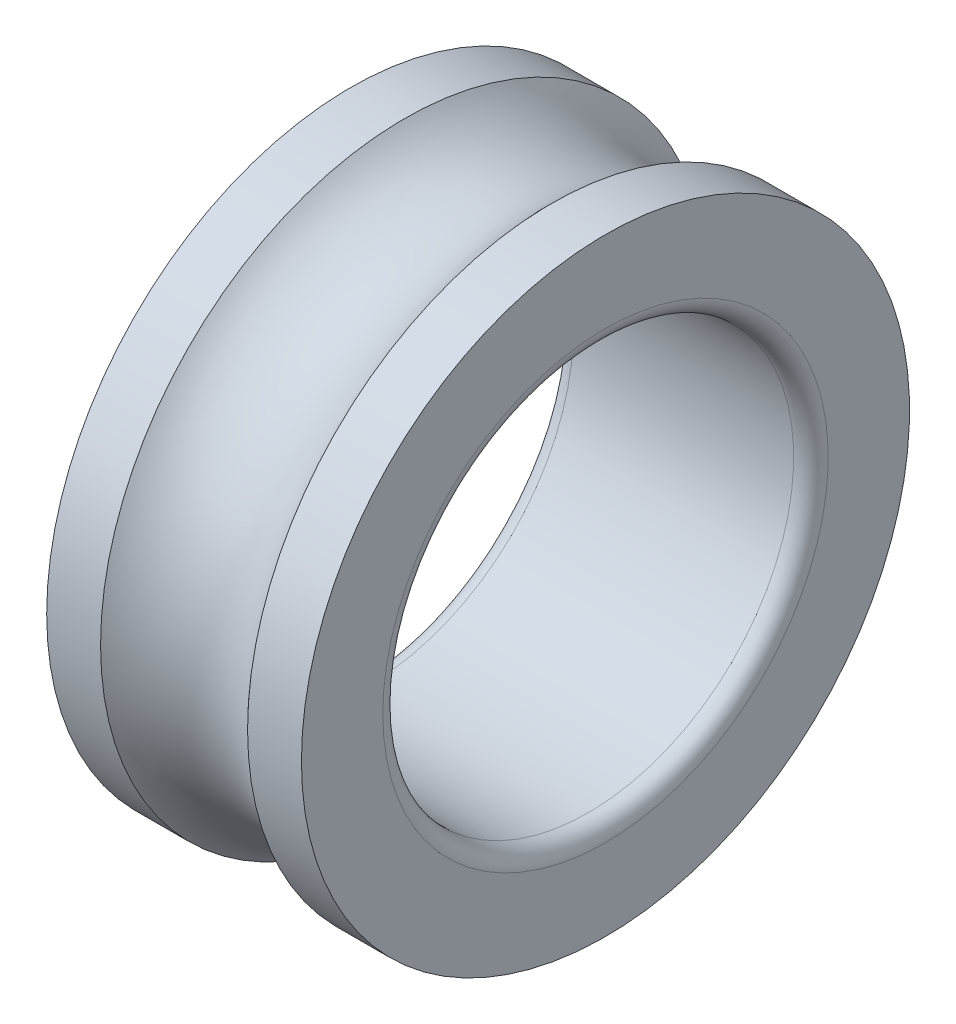
ISO-10303-21;
HEADER;
FILE_DESCRIPTION(('STEP AP214'),'2;1');
FILE_NAME('part.step','',(''),(''),'','','');
FILE_SCHEMA(('AUTOMOTIVE_DESIGN { 1 0 10303 214 1 1 1 1 }'));
ENDSEC;
DATA;
#1=APPLICATION_CONTEXT('core data for automotive mechanical design processes');
#2=APPLICATION_PROTOCOL_DEFINITION('international standard','automotive_design',2000,#1);
#3=PRODUCT_CONTEXT('',#1,'mechanical');
#4=PRODUCT('Part','Part','',(#3));
#5=PRODUCT_RELATED_PRODUCT_CATEGORY('part','',(#4));
#6=PRODUCT_DEFINITION_FORMATION('','',#4);
#7=PRODUCT_DEFINITION_CONTEXT('part definition',#1,'design');
#8=PRODUCT_DEFINITION('design','',#6,#7);
#9=PRODUCT_DEFINITION_SHAPE('','',#8);
#10=(LENGTH_UNIT() NAMED_UNIT(*) SI_UNIT(.MILLI.,.METRE.));
#11=(NAMED_UNIT(*) PLANE_ANGLE_UNIT() SI_UNIT($,.RADIAN.));
#12=(NAMED_UNIT(*) SI_UNIT($,.STERADIAN.) SOLID_ANGLE_UNIT());
#13=UNCERTAINTY_MEASURE_WITH_UNIT(LENGTH_MEASURE(1.E-05),#10,'distance_accuracy_value','');
#14=(GEOMETRIC_REPRESENTATION_CONTEXT(3) GLOBAL_UNCERTAINTY_ASSIGNED_CONTEXT((#13)) GLOBAL_UNIT_ASSIGNED_CONTEXT((#10,
#11,#12)) REPRESENTATION_CONTEXT('',''));
#15=CARTESIAN_POINT('',(0.,0.,0.));
#16=DIRECTION('',(0.,0.,1.));
#17=DIRECTION('',(1.,0.,0.));
#18=AXIS2_PLACEMENT_3D('',#15,#16,#17);
#19=CARTESIAN_POINT('',(-20.9591194968554,0.,0.));
#20=DIRECTION('',(-1.,0.,0.));
#21=DIRECTION('',(0.,0.,1.));
#22=AXIS2_PLACEMENT_3D('',#19,#20,#21);
#23=CYLINDRICAL_SURFACE('',#22,37.);
#24=CARTESIAN_POINT('',(-15.5,0.,0.));
#25=DIRECTION('',(-1.,0.,0.));
#26=DIRECTION('',(0.,0.,1.));
#27=AXIS2_PLACEMENT_3D('',#24,#25,#26);
#28=CIRCLE('',#27,37.);
#29=CARTESIAN_POINT('',(-15.5,0.,37.));
#30=VERTEX_POINT('',#29);
#31=EDGE_CURVE('E65',#30,#30,#28,.T.);
#32=ORIENTED_EDGE('',*,*,#31,.F.);
#33=EDGE_LOOP('',(#32));
#34=FACE_BOUND('',#33,.T.);
#35=CARTESIAN_POINT('',(-8.94427190999916,0.,0.));
#36=DIRECTION('',(-1.,0.,0.));
#37=DIRECTION('',(0.,0.,1.));
#38=AXIS2_PLACEMENT_3D('',#35,#36,#37);
#39=CIRCLE('',#38,37.);
#40=CARTESIAN_POINT('',(-8.94427190999916,0.,37.));
#41=VERTEX_POINT('',#40);
#42=EDGE_CURVE('E10',#41,#41,#39,.T.);
#43=ORIENTED_EDGE('',*,*,#42,.T.);
#44=EDGE_LOOP('',(#43));
#45=FACE_BOUND('',#44,.T.);
#46=ADVANCED_FACE('F37',(#34,#45),#23,.T.);
#47=CARTESIAN_POINT('',(0.,0.,0.));
#48=DIRECTION('',(-1.,0.,0.));
#49=DIRECTION('',(0.,0.,1.));
#50=AXIS2_PLACEMENT_3D('',#47,#48,#49);
#51=TOROIDAL_SURFACE('',#50,45.,12.);
#52=ORIENTED_EDGE('',*,*,#42,.F.);
#53=EDGE_LOOP('',(#52));
#54=FACE_BOUND('',#53,.T.);
#55=CARTESIAN_POINT('',(8.94427190999915,0.,0.));
#56=DIRECTION('',(-1.,0.,0.));
#57=DIRECTION('',(0.,0.,1.));
#58=AXIS2_PLACEMENT_3D('',#55,#56,#57);
#59=CIRCLE('',#58,37.);
#60=CARTESIAN_POINT('',(8.94427190999915,0.,37.));
#61=VERTEX_POINT('',#60);
#62=EDGE_CURVE('E43',#61,#61,#59,.T.);
#63=ORIENTED_EDGE('',*,*,#62,.T.);
#64=EDGE_LOOP('',(#63));
#65=FACE_BOUND('',#64,.T.);
#66=ADVANCED_FACE('F72',(#54,#65),#51,.F.);
#67=CARTESIAN_POINT('',(-20.9591194968554,0.,0.));
#68=DIRECTION('',(-1.,0.,0.));
#69=DIRECTION('',(0.,0.,1.));
#70=AXIS2_PLACEMENT_3D('',#67,#68,#69);
#71=CYLINDRICAL_SURFACE('',#70,37.);
#72=ORIENTED_EDGE('',*,*,#62,.F.);
#73=EDGE_LOOP('',(#72));
#74=FACE_BOUND('',#73,.T.);
#75=CARTESIAN_POINT('',(15.5,0.,0.));
#76=DIRECTION('',(-1.,0.,0.));
#77=DIRECTION('',(0.,0.,1.));
#78=AXIS2_PLACEMENT_3D('',#75,#76,#77);
#79=CIRCLE('',#78,37.);
#80=CARTESIAN_POINT('',(15.5,0.,37.));
#81=VERTEX_POINT('',#80);
#82=EDGE_CURVE('E47',#81,#81,#79,.T.);
#83=ORIENTED_EDGE('',*,*,#82,.T.);
#84=EDGE_LOOP('',(#83));
#85=FACE_BOUND('',#84,.T.);
#86=ADVANCED_FACE('F76',(#74,#85),#71,.T.);
#87=CARTESIAN_POINT('',(15.5,27.1,0.));
#88=DIRECTION('',(-1.,0.,0.));
#89=DIRECTION('',(0.,0.,1.));
#90=AXIS2_PLACEMENT_3D('',#87,#88,#89);
#91=PLANE('',#90);
#92=ORIENTED_EDGE('',*,*,#82,.F.);
#93=EDGE_LOOP('',(#92));
#94=FACE_BOUND('',#93,.T.);
#95=CARTESIAN_POINT('',(15.5,0.,0.));
#96=DIRECTION('',(-1.,0.,0.));
#97=DIRECTION('',(0.,0.,1.));
#98=AXIS2_PLACEMENT_3D('',#95,#96,#97);
#99=CIRCLE('',#98,27.1);
#100=CARTESIAN_POINT('',(15.5,0.,27.1));
#101=VERTEX_POINT('',#100);
#102=EDGE_CURVE('E51',#101,#101,#99,.T.);
#103=ORIENTED_EDGE('',*,*,#102,.T.);
#104=EDGE_LOOP('',(#103));
#105=FACE_BOUND('',#104,.T.);
#106=ADVANCED_FACE('F81',(#94,#105),#91,.F.);
#107=CARTESIAN_POINT('',(13.4,0.,0.));
#108=DIRECTION('',(-1.,0.,0.));
#109=DIRECTION('',(0.,0.,1.));
#110=AXIS2_PLACEMENT_3D('',#107,#108,#109);
#111=TOROIDAL_SURFACE('',#110,27.1,2.1);
#112=ORIENTED_EDGE('',*,*,#102,.F.);
#113=EDGE_LOOP('',(#112));
#114=FACE_BOUND('',#113,.T.);
#115=CARTESIAN_POINT('',(13.4,0.,0.));
#116=DIRECTION('',(-1.,0.,0.));
#117=DIRECTION('',(0.,0.,1.));
#118=AXIS2_PLACEMENT_3D('',#115,#116,#117);
#119=CIRCLE('',#118,25.);
#120=CARTESIAN_POINT('',(13.4,0.,25.));
#121=VERTEX_POINT('',#120);
#122=EDGE_CURVE('E56',#121,#121,#119,.T.);
#123=ORIENTED_EDGE('',*,*,#122,.T.);
#124=EDGE_LOOP('',(#123));
#125=FACE_BOUND('',#124,.T.);
#126=ADVANCED_FACE('F87',(#114,#125),#111,.T.);
#127=CARTESIAN_POINT('',(-20.9591194968554,0.,0.));
#128=DIRECTION('',(-1.,0.,0.));
#129=DIRECTION('',(0.,0.,1.));
#130=AXIS2_PLACEMENT_3D('',#127,#128,#129);
#131=CYLINDRICAL_SURFACE('',#130,25.);
#132=ORIENTED_EDGE('',*,*,#122,.F.);
#133=EDGE_LOOP('',(#132));
#134=FACE_BOUND('',#133,.T.);
#135=CARTESIAN_POINT('',(-13.4,0.,0.));
#136=DIRECTION('',(-1.,0.,0.));
#137=DIRECTION('',(0.,0.,1.));
#138=AXIS2_PLACEMENT_3D('',#135,#136,#137);
#139=CIRCLE('',#138,25.);
#140=CARTESIAN_POINT('',(-13.4,0.,25.));
#141=VERTEX_POINT('',#140);
#142=EDGE_CURVE('E59',#141,#141,#139,.T.);
#143=ORIENTED_EDGE('',*,*,#142,.T.);
#144=EDGE_LOOP('',(#143));
#145=FACE_BOUND('',#144,.T.);
#146=ADVANCED_FACE('F91',(#134,#145),#131,.F.);
#147=CARTESIAN_POINT('',(-13.4,0.,0.));
#148=DIRECTION('',(-1.,0.,0.));
#149=DIRECTION('',(0.,0.,1.));
#150=AXIS2_PLACEMENT_3D('',#147,#148,#149);
#151=TOROIDAL_SURFACE('',#150,27.1,2.1);
#152=ORIENTED_EDGE('',*,*,#142,.F.);
#153=EDGE_LOOP('',(#152));
#154=FACE_BOUND('',#153,.T.);
#155=CARTESIAN_POINT('',(-15.5,0.,0.));
#156=DIRECTION('',(-1.,0.,0.));
#157=DIRECTION('',(0.,0.,1.));
#158=AXIS2_PLACEMENT_3D('',#155,#156,#157);
#159=CIRCLE('',#158,27.1);
#160=CARTESIAN_POINT('',(-15.5,0.,27.1));
#161=VERTEX_POINT('',#160);
#162=EDGE_CURVE('E62',#161,#161,#159,.T.);
#163=ORIENTED_EDGE('',*,*,#162,.T.);
#164=EDGE_LOOP('',(#163));
#165=FACE_BOUND('',#164,.T.);
#166=ADVANCED_FACE('F95',(#154,#165),#151,.T.);
#167=CARTESIAN_POINT('',(-15.5,27.1,0.));
#168=DIRECTION('',(1.,0.,0.));
#169=DIRECTION('',(0.,0.,-1.));
#170=AXIS2_PLACEMENT_3D('',#167,#168,#169);
#171=PLANE('',#170);
#172=ORIENTED_EDGE('',*,*,#162,.F.);
#173=EDGE_LOOP('',(#172));
#174=FACE_BOUND('',#173,.T.);
#175=ORIENTED_EDGE('',*,*,#31,.T.);
#176=EDGE_LOOP('',(#175));
#177=FACE_BOUND('',#176,.T.);
#178=ADVANCED_FACE('F69',(#174,#177),#171,.F.);
#179=CLOSED_SHELL('',(#46,#66,#86,#106,#126,#146,#166,#178));
#180=MANIFOLD_SOLID_BREP('B2',#179);
#181=ADVANCED_BREP_SHAPE_REPRESENTATION('',(#18,#180),#14);
#182=SHAPE_DEFINITION_REPRESENTATION(#9,#181);
ENDSEC;
END-ISO-10303-21;
